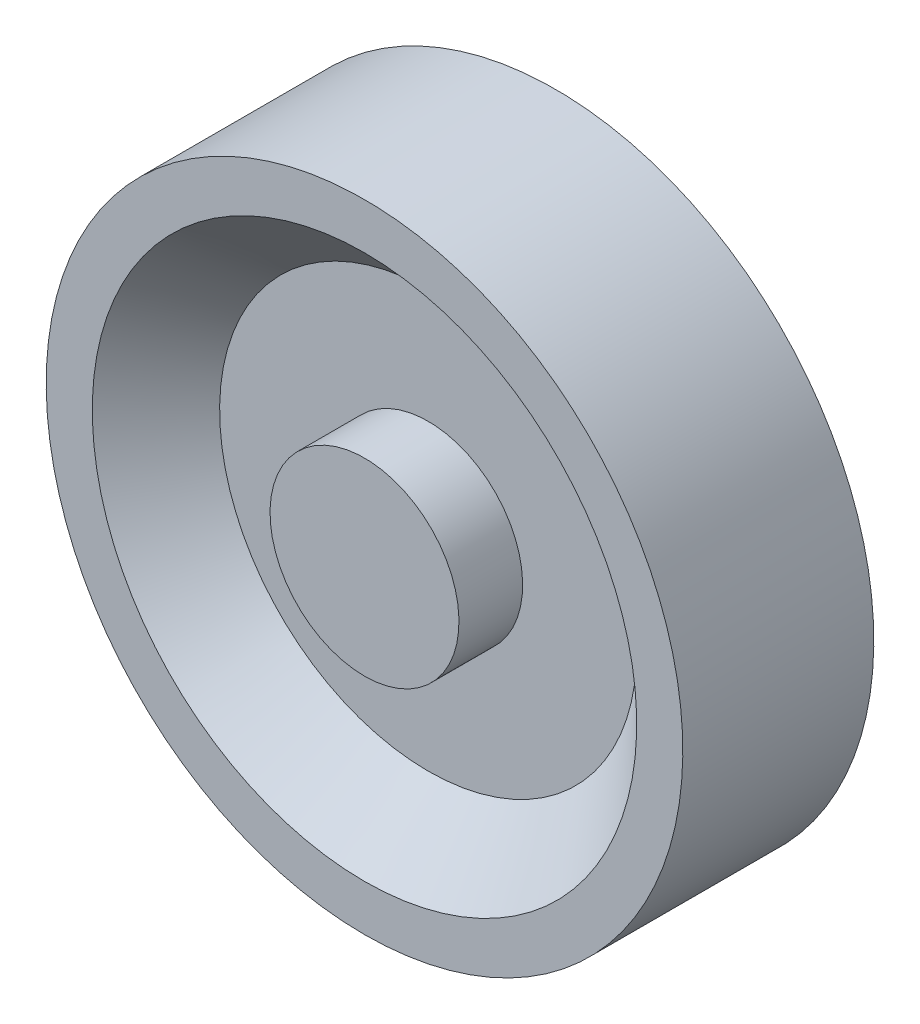
ISO-10303-21;
HEADER;
FILE_DESCRIPTION(('STEP AP214'),'2;1');
FILE_NAME('part.step','',(''),(''),'','','');
FILE_SCHEMA(('AUTOMOTIVE_DESIGN { 1 0 10303 214 1 1 1 1 }'));
ENDSEC;
DATA;
#1=APPLICATION_CONTEXT('core data for automotive mechanical design processes');
#2=APPLICATION_PROTOCOL_DEFINITION('international standard','automotive_design',2000,#1);
#3=PRODUCT_CONTEXT('',#1,'mechanical');
#4=PRODUCT('Part','Part','',(#3));
#5=PRODUCT_RELATED_PRODUCT_CATEGORY('part','',(#4));
#6=PRODUCT_DEFINITION_FORMATION('','',#4);
#7=PRODUCT_DEFINITION_CONTEXT('part definition',#1,'design');
#8=PRODUCT_DEFINITION('design','',#6,#7);
#9=PRODUCT_DEFINITION_SHAPE('','',#8);
#10=(LENGTH_UNIT() NAMED_UNIT(*) SI_UNIT(.MILLI.,.METRE.));
#11=(NAMED_UNIT(*) PLANE_ANGLE_UNIT() SI_UNIT($,.RADIAN.));
#12=(NAMED_UNIT(*) SI_UNIT($,.STERADIAN.) SOLID_ANGLE_UNIT());
#13=UNCERTAINTY_MEASURE_WITH_UNIT(LENGTH_MEASURE(1.E-05),#10,'distance_accuracy_value','');
#14=(GEOMETRIC_REPRESENTATION_CONTEXT(3) GLOBAL_UNCERTAINTY_ASSIGNED_CONTEXT((#13)) GLOBAL_UNIT_ASSIGNED_CONTEXT((#10,
#11,#12)) REPRESENTATION_CONTEXT('',''));
#15=CARTESIAN_POINT('',(0.,0.,0.));
#16=DIRECTION('',(0.,0.,1.));
#17=DIRECTION('',(1.,0.,0.));
#18=AXIS2_PLACEMENT_3D('',#15,#16,#17);
#19=CARTESIAN_POINT('',(0.,7.42,0.));
#20=DIRECTION('',(0.,0.,-1.));
#21=DIRECTION('',(0.,1.,0.));
#22=AXIS2_PLACEMENT_3D('',#19,#20,#21);
#23=PLANE('',#22);
#24=CARTESIAN_POINT('',(0.,0.,0.));
#25=DIRECTION('',(0.,0.,1.));
#26=DIRECTION('',(0.,-1.,0.));
#27=AXIS2_PLACEMENT_3D('',#24,#25,#26);
#28=CIRCLE('',#27,7.42);
#29=CARTESIAN_POINT('',(0.,-7.42,0.));
#30=VERTEX_POINT('',#29);
#31=EDGE_CURVE('E94',#30,#30,#28,.T.);
#32=ORIENTED_EDGE('',*,*,#31,.T.);
#33=EDGE_LOOP('',(#32));
#34=FACE_BOUND('',#33,.T.);
#35=ADVANCED_FACE('F43',(#34),#23,.F.);
#36=CARTESIAN_POINT('',(0.,3.,-3.));
#37=DIRECTION('',(0.,0.,1.));
#38=DIRECTION('',(0.,-1.,0.));
#39=AXIS2_PLACEMENT_3D('',#36,#37,#38);
#40=PLANE('',#39);
#41=CARTESIAN_POINT('',(0.,0.,-3.));
#42=DIRECTION('',(0.,0.,1.));
#43=DIRECTION('',(0.,-1.,0.));
#44=AXIS2_PLACEMENT_3D('',#41,#42,#43);
#45=CIRCLE('',#44,3.);
#46=CARTESIAN_POINT('',(0.,-3.,-3.));
#47=VERTEX_POINT('',#46);
#48=EDGE_CURVE('E10',#47,#47,#45,.T.);
#49=ORIENTED_EDGE('',*,*,#48,.F.);
#50=EDGE_LOOP('',(#49));
#51=FACE_BOUND('',#50,.T.);
#52=ADVANCED_FACE('F161',(#51),#40,.F.);
#53=CARTESIAN_POINT('',(0.,0.,0.));
#54=DIRECTION('',(0.,0.,1.));
#55=DIRECTION('',(0.,-1.,0.));
#56=AXIS2_PLACEMENT_3D('',#53,#54,#55);
#57=CYLINDRICAL_SURFACE('',#56,3.);
#58=CARTESIAN_POINT('',(0.,0.,-15.));
#59=DIRECTION('',(0.,0.,1.));
#60=DIRECTION('',(0.,-1.,0.));
#61=AXIS2_PLACEMENT_3D('',#58,#59,#60);
#62=CIRCLE('',#61,3.);
#63=CARTESIAN_POINT('',(0.,-3.,-15.));
#64=VERTEX_POINT('',#63);
#65=EDGE_CURVE('E50',#64,#64,#62,.T.);
#66=ORIENTED_EDGE('',*,*,#65,.F.);
#67=EDGE_LOOP('',(#66));
#68=FACE_BOUND('',#67,.T.);
#69=ORIENTED_EDGE('',*,*,#48,.T.);
#70=EDGE_LOOP('',(#69));
#71=FACE_BOUND('',#70,.T.);
#72=ADVANCED_FACE('F156',(#68,#71),#57,.F.);
#73=CARTESIAN_POINT('',(0.,3.,-15.));
#74=DIRECTION('',(0.,0.,1.));
#75=DIRECTION('',(0.,-1.,0.));
#76=AXIS2_PLACEMENT_3D('',#73,#74,#75);
#77=PLANE('',#76);
#78=CARTESIAN_POINT('',(0.,0.,-15.));
#79=DIRECTION('',(0.,0.,1.));
#80=DIRECTION('',(0.,-1.,0.));
#81=AXIS2_PLACEMENT_3D('',#78,#79,#80);
#82=CIRCLE('',#81,7.42);
#83=CARTESIAN_POINT('',(0.,-7.42,-15.));
#84=VERTEX_POINT('',#83);
#85=EDGE_CURVE('E55',#84,#84,#82,.T.);
#86=ORIENTED_EDGE('',*,*,#85,.F.);
#87=EDGE_LOOP('',(#86));
#88=FACE_BOUND('',#87,.T.);
#89=ORIENTED_EDGE('',*,*,#65,.T.);
#90=EDGE_LOOP('',(#89));
#91=FACE_BOUND('',#90,.T.);
#92=ADVANCED_FACE('F151',(#88,#91),#77,.F.);
#93=CARTESIAN_POINT('',(0.,0.,0.));
#94=DIRECTION('',(0.,0.,1.));
#95=DIRECTION('',(0.,-1.,0.));
#96=AXIS2_PLACEMENT_3D('',#93,#94,#95);
#97=CYLINDRICAL_SURFACE('',#96,7.42);
#98=CARTESIAN_POINT('',(0.,0.,-10.));
#99=DIRECTION('',(0.,0.,1.));
#100=DIRECTION('',(0.,-1.,0.));
#101=AXIS2_PLACEMENT_3D('',#98,#99,#100);
#102=CIRCLE('',#101,7.42);
#103=CARTESIAN_POINT('',(0.,-7.42,-10.));
#104=VERTEX_POINT('',#103);
#105=EDGE_CURVE('E60',#104,#104,#102,.T.);
#106=ORIENTED_EDGE('',*,*,#105,.F.);
#107=EDGE_LOOP('',(#106));
#108=FACE_BOUND('',#107,.T.);
#109=ORIENTED_EDGE('',*,*,#85,.T.);
#110=EDGE_LOOP('',(#109));
#111=FACE_BOUND('',#110,.T.);
#112=ADVANCED_FACE('F145',(#108,#111),#97,.T.);
#113=CARTESIAN_POINT('',(0.,7.42,-10.));
#114=DIRECTION('',(0.,0.,1.));
#115=DIRECTION('',(0.,-1.,0.));
#116=AXIS2_PLACEMENT_3D('',#113,#114,#115);
#117=PLANE('',#116);
#118=CARTESIAN_POINT('',(0.,0.,-10.));
#119=DIRECTION('',(0.,0.,1.));
#120=DIRECTION('',(0.,-1.,0.));
#121=AXIS2_PLACEMENT_3D('',#118,#119,#120);
#122=CIRCLE('',#121,16.38);
#123=CARTESIAN_POINT('',(0.,-16.38,-10.));
#124=VERTEX_POINT('',#123);
#125=EDGE_CURVE('E66',#124,#124,#122,.T.);
#126=ORIENTED_EDGE('',*,*,#125,.F.);
#127=EDGE_LOOP('',(#126));
#128=FACE_BOUND('',#127,.T.);
#129=ORIENTED_EDGE('',*,*,#105,.T.);
#130=EDGE_LOOP('',(#129));
#131=FACE_BOUND('',#130,.T.);
#132=ADVANCED_FACE('F139',(#128,#131),#117,.F.);
#133=CARTESIAN_POINT('',(0.,0.,-10.));
#134=DIRECTION('',(0.,0.,-1.));
#135=DIRECTION('',(0.,1.,0.));
#136=AXIS2_PLACEMENT_3D('',#133,#134,#135);
#137=CONICAL_SURFACE('',#136,16.38,0.785398163397447);
#138=CARTESIAN_POINT('',(0.,0.,-15.));
#139=DIRECTION('',(0.,0.,1.));
#140=DIRECTION('',(0.,-1.,0.));
#141=AXIS2_PLACEMENT_3D('',#138,#139,#140);
#142=CIRCLE('',#141,21.38);
#143=CARTESIAN_POINT('',(0.,-21.38,-15.));
#144=VERTEX_POINT('',#143);
#145=EDGE_CURVE('E70',#144,#144,#142,.T.);
#146=ORIENTED_EDGE('',*,*,#145,.F.);
#147=EDGE_LOOP('',(#146));
#148=FACE_BOUND('',#147,.T.);
#149=ORIENTED_EDGE('',*,*,#125,.T.);
#150=EDGE_LOOP('',(#149));
#151=FACE_BOUND('',#150,.T.);
#152=ADVANCED_FACE('F133',(#148,#151),#137,.F.);
#153=CARTESIAN_POINT('',(0.,21.38,-15.));
#154=DIRECTION('',(0.,0.,1.));
#155=DIRECTION('',(0.,-1.,0.));
#156=AXIS2_PLACEMENT_3D('',#153,#154,#155);
#157=PLANE('',#156);
#158=CARTESIAN_POINT('',(0.,0.,-15.));
#159=DIRECTION('',(0.,0.,1.));
#160=DIRECTION('',(0.,-1.,0.));
#161=AXIS2_PLACEMENT_3D('',#158,#159,#160);
#162=CIRCLE('',#161,25.);
#163=CARTESIAN_POINT('',(0.,-25.,-15.));
#164=VERTEX_POINT('',#163);
#165=EDGE_CURVE('E74',#164,#164,#162,.T.);
#166=ORIENTED_EDGE('',*,*,#165,.F.);
#167=EDGE_LOOP('',(#166));
#168=FACE_BOUND('',#167,.T.);
#169=ORIENTED_EDGE('',*,*,#145,.T.);
#170=EDGE_LOOP('',(#169));
#171=FACE_BOUND('',#170,.T.);
#172=ADVANCED_FACE('F127',(#168,#171),#157,.F.);
#173=CARTESIAN_POINT('',(0.,0.,0.));
#174=DIRECTION('',(0.,0.,1.));
#175=DIRECTION('',(0.,-1.,0.));
#176=AXIS2_PLACEMENT_3D('',#173,#174,#175);
#177=CYLINDRICAL_SURFACE('',#176,25.);
#178=CARTESIAN_POINT('',(0.,0.,0.));
#179=DIRECTION('',(0.,0.,1.));
#180=DIRECTION('',(0.,-1.,0.));
#181=AXIS2_PLACEMENT_3D('',#178,#179,#180);
#182=CIRCLE('',#181,25.);
#183=CARTESIAN_POINT('',(0.,-25.,0.));
#184=VERTEX_POINT('',#183);
#185=EDGE_CURVE('E78',#184,#184,#182,.T.);
#186=ORIENTED_EDGE('',*,*,#185,.F.);
#187=EDGE_LOOP('',(#186));
#188=FACE_BOUND('',#187,.T.);
#189=ORIENTED_EDGE('',*,*,#165,.T.);
#190=EDGE_LOOP('',(#189));
#191=FACE_BOUND('',#190,.T.);
#192=ADVANCED_FACE('F121',(#188,#191),#177,.T.);
#193=CARTESIAN_POINT('',(0.,25.,0.));
#194=DIRECTION('',(0.,0.,-1.));
#195=DIRECTION('',(0.,1.,0.));
#196=AXIS2_PLACEMENT_3D('',#193,#194,#195);
#197=PLANE('',#196);
#198=CARTESIAN_POINT('',(0.,0.,0.));
#199=DIRECTION('',(0.,0.,1.));
#200=DIRECTION('',(0.,-1.,0.));
#201=AXIS2_PLACEMENT_3D('',#198,#199,#200);
#202=CIRCLE('',#201,21.38);
#203=CARTESIAN_POINT('',(0.,-21.38,0.));
#204=VERTEX_POINT('',#203);
#205=EDGE_CURVE('E82',#204,#204,#202,.T.);
#206=ORIENTED_EDGE('',*,*,#205,.F.);
#207=EDGE_LOOP('',(#206));
#208=FACE_BOUND('',#207,.T.);
#209=ORIENTED_EDGE('',*,*,#185,.T.);
#210=EDGE_LOOP('',(#209));
#211=FACE_BOUND('',#210,.T.);
#212=ADVANCED_FACE('F115',(#208,#211),#197,.F.);
#213=CARTESIAN_POINT('',(0.,0.,0.));
#214=DIRECTION('',(0.,0.,1.));
#215=DIRECTION('',(0.,-1.,0.));
#216=AXIS2_PLACEMENT_3D('',#213,#214,#215);
#217=CONICAL_SURFACE('',#216,21.38,0.785398163397447);
#218=CARTESIAN_POINT('',(0.,0.,-5.));
#219=DIRECTION('',(0.,0.,1.));
#220=DIRECTION('',(0.,-1.,0.));
#221=AXIS2_PLACEMENT_3D('',#218,#219,#220);
#222=CIRCLE('',#221,16.38);
#223=CARTESIAN_POINT('',(0.,-16.38,-5.));
#224=VERTEX_POINT('',#223);
#225=EDGE_CURVE('E86',#224,#224,#222,.T.);
#226=ORIENTED_EDGE('',*,*,#225,.F.);
#227=EDGE_LOOP('',(#226));
#228=FACE_BOUND('',#227,.T.);
#229=ORIENTED_EDGE('',*,*,#205,.T.);
#230=EDGE_LOOP('',(#229));
#231=FACE_BOUND('',#230,.T.);
#232=ADVANCED_FACE('F109',(#228,#231),#217,.F.);
#233=CARTESIAN_POINT('',(0.,7.42,-5.));
#234=DIRECTION('',(0.,0.,-1.));
#235=DIRECTION('',(0.,1.,0.));
#236=AXIS2_PLACEMENT_3D('',#233,#234,#235);
#237=PLANE('',#236);
#238=CARTESIAN_POINT('',(0.,0.,-5.));
#239=DIRECTION('',(0.,0.,1.));
#240=DIRECTION('',(0.,-1.,0.));
#241=AXIS2_PLACEMENT_3D('',#238,#239,#240);
#242=CIRCLE('',#241,7.42);
#243=CARTESIAN_POINT('',(0.,-7.42,-5.));
#244=VERTEX_POINT('',#243);
#245=EDGE_CURVE('E90',#244,#244,#242,.T.);
#246=ORIENTED_EDGE('',*,*,#245,.F.);
#247=EDGE_LOOP('',(#246));
#248=FACE_BOUND('',#247,.T.);
#249=ORIENTED_EDGE('',*,*,#225,.T.);
#250=EDGE_LOOP('',(#249));
#251=FACE_BOUND('',#250,.T.);
#252=ADVANCED_FACE('F103',(#248,#251),#237,.F.);
#253=CARTESIAN_POINT('',(0.,0.,0.));
#254=DIRECTION('',(0.,0.,1.));
#255=DIRECTION('',(0.,-1.,0.));
#256=AXIS2_PLACEMENT_3D('',#253,#254,#255);
#257=CYLINDRICAL_SURFACE('',#256,7.42);
#258=ORIENTED_EDGE('',*,*,#31,.F.);
#259=EDGE_LOOP('',(#258));
#260=FACE_BOUND('',#259,.T.);
#261=ORIENTED_EDGE('',*,*,#245,.T.);
#262=EDGE_LOOP('',(#261));
#263=FACE_BOUND('',#262,.T.);
#264=ADVANCED_FACE('F100',(#260,#263),#257,.T.);
#265=CLOSED_SHELL('',(#35,#52,#72,#92,#112,#132,#152,#172,#192,#212,#232,#252,#264));
#266=MANIFOLD_SOLID_BREP('B2',#265);
#267=ADVANCED_BREP_SHAPE_REPRESENTATION('',(#18,#266),#14);
#268=SHAPE_DEFINITION_REPRESENTATION(#9,#267);
ENDSEC;
END-ISO-10303-21;
